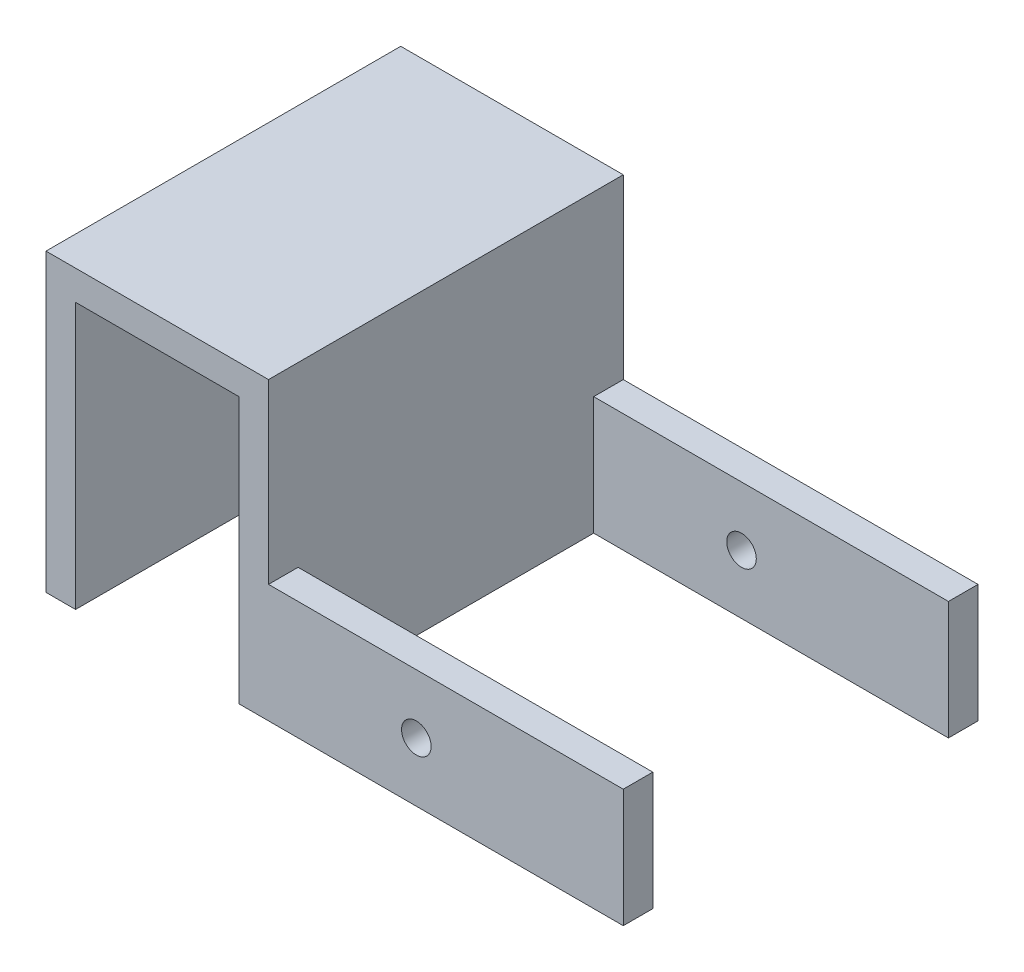
ISO-10303-21;
HEADER;
FILE_DESCRIPTION(('STEP AP214'),'2;1');
FILE_NAME('part.step','',(''),(''),'','','');
FILE_SCHEMA(('AUTOMOTIVE_DESIGN { 1 0 10303 214 1 1 1 1 }'));
ENDSEC;
DATA;
#1=APPLICATION_CONTEXT('core data for automotive mechanical design processes');
#2=APPLICATION_PROTOCOL_DEFINITION('international standard','automotive_design',2000,#1);
#3=PRODUCT_CONTEXT('',#1,'mechanical');
#4=PRODUCT('Part','Part','',(#3));
#5=PRODUCT_RELATED_PRODUCT_CATEGORY('part','',(#4));
#6=PRODUCT_DEFINITION_FORMATION('','',#4);
#7=PRODUCT_DEFINITION_CONTEXT('part definition',#1,'design');
#8=PRODUCT_DEFINITION('design','',#6,#7);
#9=PRODUCT_DEFINITION_SHAPE('','',#8);
#10=(LENGTH_UNIT() NAMED_UNIT(*) SI_UNIT(.MILLI.,.METRE.));
#11=(NAMED_UNIT(*) PLANE_ANGLE_UNIT() SI_UNIT($,.RADIAN.));
#12=(NAMED_UNIT(*) SI_UNIT($,.STERADIAN.) SOLID_ANGLE_UNIT());
#13=UNCERTAINTY_MEASURE_WITH_UNIT(LENGTH_MEASURE(1.E-05),#10,'distance_accuracy_value','');
#14=(GEOMETRIC_REPRESENTATION_CONTEXT(3) GLOBAL_UNCERTAINTY_ASSIGNED_CONTEXT((#13)) GLOBAL_UNIT_ASSIGNED_CONTEXT((#10,
#11,#12)) REPRESENTATION_CONTEXT('',''));
#15=CARTESIAN_POINT('',(0.,0.,0.));
#16=DIRECTION('',(0.,0.,1.));
#17=DIRECTION('',(1.,0.,0.));
#18=AXIS2_PLACEMENT_3D('',#15,#16,#17);
#19=CARTESIAN_POINT('',(5.,0.,30.));
#20=DIRECTION('',(0.,1.,0.));
#21=DIRECTION('',(-1.,0.,0.));
#22=AXIS2_PLACEMENT_3D('',#19,#20,#21);
#23=PLANE('',#22);
#24=DIRECTION('',(1.,0.,0.));
#25=VECTOR('',#24,1.);
#26=CARTESIAN_POINT('',(5.,0.,-30.));
#27=LINE('',#26,#25);
#28=CARTESIAN_POINT('',(0.,0.,-30.));
#29=VERTEX_POINT('',#28);
#30=CARTESIAN_POINT('',(5.,0.,-30.));
#31=VERTEX_POINT('',#30);
#32=EDGE_CURVE('E195',#29,#31,#27,.T.);
#33=ORIENTED_EDGE('',*,*,#32,.T.);
#34=DIRECTION('',(0.,0.,-1.));
#35=VECTOR('',#34,1.);
#36=CARTESIAN_POINT('',(5.,0.,30.));
#37=LINE('',#36,#35);
#38=CARTESIAN_POINT('',(5.,0.,30.));
#39=VERTEX_POINT('',#38);
#40=EDGE_CURVE('E11',#39,#31,#37,.T.);
#41=ORIENTED_EDGE('',*,*,#40,.F.);
#42=DIRECTION('',(1.,0.,0.));
#43=VECTOR('',#42,1.);
#44=CARTESIAN_POINT('',(5.,0.,30.));
#45=LINE('',#44,#43);
#46=CARTESIAN_POINT('',(0.,0.,30.));
#47=VERTEX_POINT('',#46);
#48=EDGE_CURVE('E199',#47,#39,#45,.T.);
#49=ORIENTED_EDGE('',*,*,#48,.F.);
#50=DIRECTION('',(0.,0.,-1.));
#51=VECTOR('',#50,1.);
#52=CARTESIAN_POINT('',(0.,0.,30.));
#53=LINE('',#52,#51);
#54=EDGE_CURVE('E217',#47,#29,#53,.T.);
#55=ORIENTED_EDGE('',*,*,#54,.T.);
#56=EDGE_LOOP('',(#33,#41,#49,#55));
#57=FACE_BOUND('',#56,.T.);
#58=ADVANCED_FACE('F33',(#57),#23,.F.);
#59=CARTESIAN_POINT('',(5.,0.,30.));
#60=DIRECTION('',(-1.,0.,0.));
#61=DIRECTION('',(0.,0.,1.));
#62=AXIS2_PLACEMENT_3D('',#59,#60,#61);
#63=PLANE('',#62);
#64=DIRECTION('',(0.,1.,0.));
#65=VECTOR('',#64,1.);
#66=CARTESIAN_POINT('',(5.,0.,-30.));
#67=LINE('',#66,#65);
#68=CARTESIAN_POINT('',(5.,45.,-30.));
#69=VERTEX_POINT('',#68);
#70=EDGE_CURVE('E220',#31,#69,#67,.T.);
#71=ORIENTED_EDGE('',*,*,#70,.T.);
#72=DIRECTION('',(0.,0.,-1.));
#73=VECTOR('',#72,1.);
#74=CARTESIAN_POINT('',(5.,45.,30.));
#75=LINE('',#74,#73);
#76=CARTESIAN_POINT('',(5.,45.,30.));
#77=VERTEX_POINT('',#76);
#78=EDGE_CURVE('E41',#77,#69,#75,.T.);
#79=ORIENTED_EDGE('',*,*,#78,.F.);
#80=DIRECTION('',(0.,1.,0.));
#81=VECTOR('',#80,1.);
#82=CARTESIAN_POINT('',(5.,0.,30.));
#83=LINE('',#82,#81);
#84=EDGE_CURVE('E202',#39,#77,#83,.T.);
#85=ORIENTED_EDGE('',*,*,#84,.F.);
#86=ORIENTED_EDGE('',*,*,#40,.T.);
#87=EDGE_LOOP('',(#71,#79,#85,#86));
#88=FACE_BOUND('',#87,.T.);
#89=ADVANCED_FACE('F282',(#88),#63,.F.);
#90=CARTESIAN_POINT('',(5.,45.,30.));
#91=DIRECTION('',(0.,1.,0.));
#92=DIRECTION('',(0.,0.,1.));
#93=AXIS2_PLACEMENT_3D('',#90,#91,#92);
#94=PLANE('',#93);
#95=DIRECTION('',(1.,0.,0.));
#96=VECTOR('',#95,1.);
#97=CARTESIAN_POINT('',(5.,45.,-30.));
#98=LINE('',#97,#96);
#99=CARTESIAN_POINT('',(32.64,45.,-30.));
#100=VERTEX_POINT('',#99);
#101=EDGE_CURVE('E222',#69,#100,#98,.T.);
#102=ORIENTED_EDGE('',*,*,#101,.T.);
#103=DIRECTION('',(0.,0.,-1.));
#104=VECTOR('',#103,1.);
#105=CARTESIAN_POINT('',(32.64,45.,30.));
#106=LINE('',#105,#104);
#107=CARTESIAN_POINT('',(32.64,45.,30.));
#108=VERTEX_POINT('',#107);
#109=EDGE_CURVE('E240',#108,#100,#106,.T.);
#110=ORIENTED_EDGE('',*,*,#109,.F.);
#111=DIRECTION('',(1.,0.,0.));
#112=VECTOR('',#111,1.);
#113=CARTESIAN_POINT('',(5.,45.,30.));
#114=LINE('',#113,#112);
#115=EDGE_CURVE('E205',#77,#108,#114,.T.);
#116=ORIENTED_EDGE('',*,*,#115,.F.);
#117=ORIENTED_EDGE('',*,*,#78,.T.);
#118=EDGE_LOOP('',(#102,#110,#116,#117));
#119=FACE_BOUND('',#118,.T.);
#120=ADVANCED_FACE('F248',(#119),#94,.F.);
#121=CARTESIAN_POINT('',(32.64,45.,30.));
#122=DIRECTION('',(1.,0.,0.));
#123=DIRECTION('',(0.,1.,0.));
#124=AXIS2_PLACEMENT_3D('',#121,#122,#123);
#125=PLANE('',#124);
#126=DIRECTION('',(0.,-1.,0.));
#127=VECTOR('',#126,1.);
#128=CARTESIAN_POINT('',(32.64,45.,-30.));
#129=LINE('',#128,#127);
#130=CARTESIAN_POINT('',(32.64,0.,-30.));
#131=VERTEX_POINT('',#130);
#132=EDGE_CURVE('E224',#100,#131,#129,.T.);
#133=ORIENTED_EDGE('',*,*,#132,.T.);
#134=DIRECTION('',(0.,0.,-1.));
#135=VECTOR('',#134,1.);
#136=CARTESIAN_POINT('',(32.64,0.,30.));
#137=LINE('',#136,#135);
#138=CARTESIAN_POINT('',(32.64,0.,30.));
#139=VERTEX_POINT('',#138);
#140=EDGE_CURVE('E237',#139,#131,#137,.T.);
#141=ORIENTED_EDGE('',*,*,#140,.F.);
#142=DIRECTION('',(0.,-1.,0.));
#143=VECTOR('',#142,1.);
#144=CARTESIAN_POINT('',(32.64,45.,30.));
#145=LINE('',#144,#143);
#146=EDGE_CURVE('E207',#108,#139,#145,.T.);
#147=ORIENTED_EDGE('',*,*,#146,.F.);
#148=ORIENTED_EDGE('',*,*,#109,.T.);
#149=EDGE_LOOP('',(#133,#141,#147,#148));
#150=FACE_BOUND('',#149,.T.);
#151=ADVANCED_FACE('F255',(#150),#125,.F.);
#152=CARTESIAN_POINT('',(37.64,0.,30.));
#153=DIRECTION('',(0.,1.,0.));
#154=DIRECTION('',(-1.,0.,0.));
#155=AXIS2_PLACEMENT_3D('',#152,#153,#154);
#156=PLANE('',#155);
#157=DIRECTION('',(1.,0.,0.));
#158=VECTOR('',#157,1.);
#159=CARTESIAN_POINT('',(37.64,0.,-30.));
#160=LINE('',#159,#158);
#161=CARTESIAN_POINT('',(97.64,-1.35493385389689E-13,-30.));
#162=VERTEX_POINT('',#161);
#163=EDGE_CURVE('E145',#131,#162,#160,.T.);
#164=ORIENTED_EDGE('',*,*,#163,.T.);
#165=DIRECTION('',(0.,0.,1.));
#166=VECTOR('',#165,1.);
#167=CARTESIAN_POINT('',(97.64,-1.35493385389689E-13,-30.));
#168=LINE('',#167,#166);
#169=CARTESIAN_POINT('',(97.64,-1.35493385389689E-13,-25.));
#170=VERTEX_POINT('',#169);
#171=EDGE_CURVE('E164',#162,#170,#168,.T.);
#172=ORIENTED_EDGE('',*,*,#171,.T.);
#173=DIRECTION('',(-1.,0.,0.));
#174=VECTOR('',#173,1.);
#175=CARTESIAN_POINT('',(97.64,-1.35493385389689E-13,-25.));
#176=LINE('',#175,#174);
#177=CARTESIAN_POINT('',(37.64,0.,-25.));
#178=VERTEX_POINT('',#177);
#179=EDGE_CURVE('E161',#170,#178,#176,.T.);
#180=ORIENTED_EDGE('',*,*,#179,.T.);
#181=DIRECTION('',(0.,0.,-1.));
#182=VECTOR('',#181,1.);
#183=CARTESIAN_POINT('',(37.64,0.,30.));
#184=LINE('',#183,#182);
#185=CARTESIAN_POINT('',(37.64,0.,25.));
#186=VERTEX_POINT('',#185);
#187=EDGE_CURVE('E53',#186,#178,#184,.T.);
#188=ORIENTED_EDGE('',*,*,#187,.F.);
#189=DIRECTION('',(1.,0.,0.));
#190=VECTOR('',#189,1.);
#191=CARTESIAN_POINT('',(97.64,-1.35493385389689E-13,25.));
#192=LINE('',#191,#190);
#193=CARTESIAN_POINT('',(97.64,-1.35493385389689E-13,25.));
#194=VERTEX_POINT('',#193);
#195=EDGE_CURVE('E170',#186,#194,#192,.T.);
#196=ORIENTED_EDGE('',*,*,#195,.T.);
#197=DIRECTION('',(0.,0.,1.));
#198=VECTOR('',#197,1.);
#199=CARTESIAN_POINT('',(97.64,-1.35493385389689E-13,30.));
#200=LINE('',#199,#198);
#201=CARTESIAN_POINT('',(97.64,-1.35493385389689E-13,30.));
#202=VERTEX_POINT('',#201);
#203=EDGE_CURVE('E178',#194,#202,#200,.T.);
#204=ORIENTED_EDGE('',*,*,#203,.T.);
#205=DIRECTION('',(1.,0.,0.));
#206=VECTOR('',#205,1.);
#207=CARTESIAN_POINT('',(37.64,0.,30.));
#208=LINE('',#207,#206);
#209=EDGE_CURVE('E209',#139,#202,#208,.T.);
#210=ORIENTED_EDGE('',*,*,#209,.F.);
#211=ORIENTED_EDGE('',*,*,#140,.T.);
#212=EDGE_LOOP('',(#164,#172,#180,#188,#196,#204,#210,#211));
#213=FACE_BOUND('',#212,.T.);
#214=ADVANCED_FACE('F259',(#213),#156,.F.);
#215=CARTESIAN_POINT('',(37.64,50.,30.));
#216=DIRECTION('',(-1.,0.,0.));
#217=DIRECTION('',(0.,-1.,0.));
#218=AXIS2_PLACEMENT_3D('',#215,#216,#217);
#219=PLANE('',#218);
#220=ORIENTED_EDGE('',*,*,#187,.T.);
#221=DIRECTION('',(0.,-1.,0.));
#222=VECTOR('',#221,1.);
#223=CARTESIAN_POINT('',(37.64,19.9999999999999,-25.));
#224=LINE('',#223,#222);
#225=CARTESIAN_POINT('',(37.64,19.9999999999999,-25.));
#226=VERTEX_POINT('',#225);
#227=EDGE_CURVE('E48',#226,#178,#224,.T.);
#228=ORIENTED_EDGE('',*,*,#227,.F.);
#229=DIRECTION('',(0.,0.,-1.));
#230=VECTOR('',#229,1.);
#231=CARTESIAN_POINT('',(37.64,19.9999999999999,-25.));
#232=LINE('',#231,#230);
#233=CARTESIAN_POINT('',(37.64,19.9999999999999,-30.));
#234=VERTEX_POINT('',#233);
#235=EDGE_CURVE('E147',#226,#234,#232,.T.);
#236=ORIENTED_EDGE('',*,*,#235,.T.);
#237=DIRECTION('',(0.,1.,0.));
#238=VECTOR('',#237,1.);
#239=CARTESIAN_POINT('',(37.64,50.,-30.));
#240=LINE('',#239,#238);
#241=CARTESIAN_POINT('',(37.64,50.,-30.));
#242=VERTEX_POINT('',#241);
#243=EDGE_CURVE('E134',#234,#242,#240,.T.);
#244=ORIENTED_EDGE('',*,*,#243,.T.);
#245=DIRECTION('',(0.,0.,-1.));
#246=VECTOR('',#245,1.);
#247=CARTESIAN_POINT('',(37.64,50.,30.));
#248=LINE('',#247,#246);
#249=CARTESIAN_POINT('',(37.64,50.,30.));
#250=VERTEX_POINT('',#249);
#251=EDGE_CURVE('E234',#250,#242,#248,.T.);
#252=ORIENTED_EDGE('',*,*,#251,.F.);
#253=DIRECTION('',(0.,1.,0.));
#254=VECTOR('',#253,1.);
#255=CARTESIAN_POINT('',(37.64,50.,30.));
#256=LINE('',#255,#254);
#257=CARTESIAN_POINT('',(37.64,19.9999999999999,30.));
#258=VERTEX_POINT('',#257);
#259=EDGE_CURVE('E211',#258,#250,#256,.T.);
#260=ORIENTED_EDGE('',*,*,#259,.F.);
#261=DIRECTION('',(0.,0.,-1.));
#262=VECTOR('',#261,1.);
#263=CARTESIAN_POINT('',(37.64,19.9999999999999,25.));
#264=LINE('',#263,#262);
#265=CARTESIAN_POINT('',(37.64,19.9999999999999,25.));
#266=VERTEX_POINT('',#265);
#267=EDGE_CURVE('E174',#258,#266,#264,.T.);
#268=ORIENTED_EDGE('',*,*,#267,.T.);
#269=DIRECTION('',(0.,-1.,0.));
#270=VECTOR('',#269,1.);
#271=CARTESIAN_POINT('',(37.64,19.9999999999999,25.));
#272=LINE('',#271,#270);
#273=EDGE_CURVE('E187',#266,#186,#272,.T.);
#274=ORIENTED_EDGE('',*,*,#273,.T.);
#275=EDGE_LOOP('',(#220,#228,#236,#244,#252,#260,#268,#274));
#276=FACE_BOUND('',#275,.T.);
#277=ADVANCED_FACE('F148',(#276),#219,.F.);
#278=CARTESIAN_POINT('',(0.,50.,30.));
#279=DIRECTION('',(0.,-1.,0.));
#280=DIRECTION('',(1.,0.,0.));
#281=AXIS2_PLACEMENT_3D('',#278,#279,#280);
#282=PLANE('',#281);
#283=DIRECTION('',(-1.,0.,0.));
#284=VECTOR('',#283,1.);
#285=CARTESIAN_POINT('',(0.,50.,-30.));
#286=LINE('',#285,#284);
#287=CARTESIAN_POINT('',(0.,50.,-30.));
#288=VERTEX_POINT('',#287);
#289=EDGE_CURVE('E142',#242,#288,#286,.T.);
#290=ORIENTED_EDGE('',*,*,#289,.T.);
#291=DIRECTION('',(0.,0.,-1.));
#292=VECTOR('',#291,1.);
#293=CARTESIAN_POINT('',(0.,50.,30.));
#294=LINE('',#293,#292);
#295=CARTESIAN_POINT('',(0.,50.,30.));
#296=VERTEX_POINT('',#295);
#297=EDGE_CURVE('E231',#296,#288,#294,.T.);
#298=ORIENTED_EDGE('',*,*,#297,.F.);
#299=DIRECTION('',(-1.,0.,0.));
#300=VECTOR('',#299,1.);
#301=CARTESIAN_POINT('',(0.,50.,30.));
#302=LINE('',#301,#300);
#303=EDGE_CURVE('E213',#250,#296,#302,.T.);
#304=ORIENTED_EDGE('',*,*,#303,.F.);
#305=ORIENTED_EDGE('',*,*,#251,.T.);
#306=EDGE_LOOP('',(#290,#298,#304,#305));
#307=FACE_BOUND('',#306,.T.);
#308=ADVANCED_FACE('F274',(#307),#282,.F.);
#309=CARTESIAN_POINT('',(0.,0.,30.));
#310=DIRECTION('',(1.,0.,0.));
#311=DIRECTION('',(0.,1.,0.));
#312=AXIS2_PLACEMENT_3D('',#309,#310,#311);
#313=PLANE('',#312);
#314=DIRECTION('',(0.,-1.,0.));
#315=VECTOR('',#314,1.);
#316=CARTESIAN_POINT('',(0.,0.,-30.));
#317=LINE('',#316,#315);
#318=EDGE_CURVE('E203',#288,#29,#317,.T.);
#319=ORIENTED_EDGE('',*,*,#318,.T.);
#320=ORIENTED_EDGE('',*,*,#54,.F.);
#321=DIRECTION('',(0.,-1.,0.));
#322=VECTOR('',#321,1.);
#323=CARTESIAN_POINT('',(0.,0.,30.));
#324=LINE('',#323,#322);
#325=EDGE_CURVE('E215',#296,#47,#324,.T.);
#326=ORIENTED_EDGE('',*,*,#325,.F.);
#327=ORIENTED_EDGE('',*,*,#297,.T.);
#328=EDGE_LOOP('',(#319,#320,#326,#327));
#329=FACE_BOUND('',#328,.T.);
#330=ADVANCED_FACE('F280',(#329),#313,.F.);
#331=CARTESIAN_POINT('',(0.,0.,30.));
#332=DIRECTION('',(0.,0.,-1.));
#333=DIRECTION('',(-1.,0.,0.));
#334=AXIS2_PLACEMENT_3D('',#331,#332,#333);
#335=PLANE('',#334);
#336=CARTESIAN_POINT('',(62.64,9.99999999999986,30.));
#337=DIRECTION('',(0.,0.,1.));
#338=DIRECTION('',(1.,0.,0.));
#339=AXIS2_PLACEMENT_3D('',#336,#337,#338);
#340=CIRCLE('',#339,2.49999999999999);
#341=CARTESIAN_POINT('',(65.14,9.99999999999986,30.));
#342=VERTEX_POINT('',#341);
#343=EDGE_CURVE('E338',#342,#342,#340,.T.);
#344=ORIENTED_EDGE('',*,*,#343,.F.);
#345=EDGE_LOOP('',(#344));
#346=FACE_BOUND('',#345,.T.);
#347=ORIENTED_EDGE('',*,*,#48,.T.);
#348=ORIENTED_EDGE('',*,*,#84,.T.);
#349=ORIENTED_EDGE('',*,*,#115,.T.);
#350=ORIENTED_EDGE('',*,*,#146,.T.);
#351=ORIENTED_EDGE('',*,*,#209,.T.);
#352=DIRECTION('',(0.,-1.,0.));
#353=VECTOR('',#352,1.);
#354=CARTESIAN_POINT('',(97.64,19.9999999999999,30.));
#355=LINE('',#354,#353);
#356=CARTESIAN_POINT('',(97.64,19.9999999999999,30.));
#357=VERTEX_POINT('',#356);
#358=EDGE_CURVE('E192',#357,#202,#355,.T.);
#359=ORIENTED_EDGE('',*,*,#358,.F.);
#360=DIRECTION('',(-1.,0.,0.));
#361=VECTOR('',#360,1.);
#362=CARTESIAN_POINT('',(37.64,19.9999999999999,30.));
#363=LINE('',#362,#361);
#364=EDGE_CURVE('E184',#357,#258,#363,.T.);
#365=ORIENTED_EDGE('',*,*,#364,.T.);
#366=ORIENTED_EDGE('',*,*,#259,.T.);
#367=ORIENTED_EDGE('',*,*,#303,.T.);
#368=ORIENTED_EDGE('',*,*,#325,.T.);
#369=EDGE_LOOP('',(#347,#348,#349,#350,#351,#359,#365,#366,#367,#368));
#370=FACE_BOUND('',#369,.T.);
#371=ADVANCED_FACE('F262',(#346,#370),#335,.F.);
#372=CARTESIAN_POINT('',(0.,0.,-30.));
#373=DIRECTION('',(0.,0.,-1.));
#374=DIRECTION('',(-1.,0.,0.));
#375=AXIS2_PLACEMENT_3D('',#372,#373,#374);
#376=PLANE('',#375);
#377=CARTESIAN_POINT('',(62.64,9.99999999999986,-30.));
#378=DIRECTION('',(0.,0.,1.));
#379=DIRECTION('',(1.,0.,0.));
#380=AXIS2_PLACEMENT_3D('',#377,#378,#379);
#381=CIRCLE('',#380,2.49999999999999);
#382=CARTESIAN_POINT('',(65.14,9.99999999999986,-30.));
#383=VERTEX_POINT('',#382);
#384=EDGE_CURVE('E337',#383,#383,#381,.T.);
#385=ORIENTED_EDGE('',*,*,#384,.T.);
#386=EDGE_LOOP('',(#385));
#387=FACE_BOUND('',#386,.T.);
#388=ORIENTED_EDGE('',*,*,#32,.F.);
#389=ORIENTED_EDGE('',*,*,#318,.F.);
#390=ORIENTED_EDGE('',*,*,#289,.F.);
#391=ORIENTED_EDGE('',*,*,#243,.F.);
#392=DIRECTION('',(1.,0.,0.));
#393=VECTOR('',#392,1.);
#394=CARTESIAN_POINT('',(37.64,19.9999999999999,-30.));
#395=LINE('',#394,#393);
#396=CARTESIAN_POINT('',(97.64,19.9999999999999,-30.));
#397=VERTEX_POINT('',#396);
#398=EDGE_CURVE('E139',#234,#397,#395,.T.);
#399=ORIENTED_EDGE('',*,*,#398,.T.);
#400=DIRECTION('',(0.,-1.,0.));
#401=VECTOR('',#400,1.);
#402=CARTESIAN_POINT('',(97.64,19.9999999999999,-30.));
#403=LINE('',#402,#401);
#404=EDGE_CURVE('E171',#397,#162,#403,.T.);
#405=ORIENTED_EDGE('',*,*,#404,.T.);
#406=ORIENTED_EDGE('',*,*,#163,.F.);
#407=ORIENTED_EDGE('',*,*,#132,.F.);
#408=ORIENTED_EDGE('',*,*,#101,.F.);
#409=ORIENTED_EDGE('',*,*,#70,.F.);
#410=EDGE_LOOP('',(#388,#389,#390,#391,#399,#405,#406,#407,#408,#409));
#411=FACE_BOUND('',#410,.T.);
#412=ADVANCED_FACE('F136',(#387,#411),#376,.T.);
#413=CARTESIAN_POINT('',(97.64,19.9999999999999,30.));
#414=DIRECTION('',(1.,0.,0.));
#415=DIRECTION('',(0.,1.,0.));
#416=AXIS2_PLACEMENT_3D('',#413,#414,#415);
#417=PLANE('',#416);
#418=ORIENTED_EDGE('',*,*,#203,.F.);
#419=DIRECTION('',(0.,-1.,0.));
#420=VECTOR('',#419,1.);
#421=CARTESIAN_POINT('',(97.64,19.9999999999999,25.));
#422=LINE('',#421,#420);
#423=CARTESIAN_POINT('',(97.64,19.9999999999999,25.));
#424=VERTEX_POINT('',#423);
#425=EDGE_CURVE('E196',#424,#194,#422,.T.);
#426=ORIENTED_EDGE('',*,*,#425,.F.);
#427=DIRECTION('',(0.,0.,1.));
#428=VECTOR('',#427,1.);
#429=CARTESIAN_POINT('',(97.64,19.9999999999999,30.));
#430=LINE('',#429,#428);
#431=EDGE_CURVE('E181',#424,#357,#430,.T.);
#432=ORIENTED_EDGE('',*,*,#431,.T.);
#433=ORIENTED_EDGE('',*,*,#358,.T.);
#434=EDGE_LOOP('',(#418,#426,#432,#433));
#435=FACE_BOUND('',#434,.T.);
#436=ADVANCED_FACE('F264',(#435),#417,.T.);
#437=CARTESIAN_POINT('',(97.64,19.9999999999999,25.));
#438=DIRECTION('',(0.,0.,-1.));
#439=DIRECTION('',(-1.,0.,0.));
#440=AXIS2_PLACEMENT_3D('',#437,#438,#439);
#441=PLANE('',#440);
#442=CARTESIAN_POINT('',(62.64,9.99999999999986,25.));
#443=DIRECTION('',(0.,0.,-1.));
#444=DIRECTION('',(-1.,0.,0.));
#445=AXIS2_PLACEMENT_3D('',#442,#443,#444);
#446=CIRCLE('',#445,2.49999999999999);
#447=CARTESIAN_POINT('',(60.14,9.99999999999986,25.));
#448=VERTEX_POINT('',#447);
#449=EDGE_CURVE('E165',#448,#448,#446,.T.);
#450=ORIENTED_EDGE('',*,*,#449,.F.);
#451=EDGE_LOOP('',(#450));
#452=FACE_BOUND('',#451,.T.);
#453=ORIENTED_EDGE('',*,*,#195,.F.);
#454=ORIENTED_EDGE('',*,*,#273,.F.);
#455=DIRECTION('',(1.,0.,0.));
#456=VECTOR('',#455,1.);
#457=CARTESIAN_POINT('',(97.64,19.9999999999999,25.));
#458=LINE('',#457,#456);
#459=EDGE_CURVE('E177',#266,#424,#458,.T.);
#460=ORIENTED_EDGE('',*,*,#459,.T.);
#461=ORIENTED_EDGE('',*,*,#425,.T.);
#462=EDGE_LOOP('',(#453,#454,#460,#461));
#463=FACE_BOUND('',#462,.T.);
#464=ADVANCED_FACE('F306',(#452,#463),#441,.T.);
#465=CARTESIAN_POINT('',(0.,20.,0.));
#466=DIRECTION('',(0.,1.,0.));
#467=DIRECTION('',(-1.,0.,0.));
#468=AXIS2_PLACEMENT_3D('',#465,#466,#467);
#469=PLANE('',#468);
#470=ORIENTED_EDGE('',*,*,#267,.F.);
#471=ORIENTED_EDGE('',*,*,#364,.F.);
#472=ORIENTED_EDGE('',*,*,#431,.F.);
#473=ORIENTED_EDGE('',*,*,#459,.F.);
#474=EDGE_LOOP('',(#470,#471,#472,#473));
#475=FACE_BOUND('',#474,.T.);
#476=ADVANCED_FACE('F269',(#475),#469,.T.);
#477=CARTESIAN_POINT('',(97.64,19.9999999999999,-25.));
#478=DIRECTION('',(0.,0.,1.));
#479=DIRECTION('',(1.,0.,0.));
#480=AXIS2_PLACEMENT_3D('',#477,#478,#479);
#481=PLANE('',#480);
#482=CARTESIAN_POINT('',(62.64,9.99999999999986,-25.));
#483=DIRECTION('',(0.,0.,1.));
#484=DIRECTION('',(1.,0.,0.));
#485=AXIS2_PLACEMENT_3D('',#482,#483,#484);
#486=CIRCLE('',#485,2.49999999999999);
#487=CARTESIAN_POINT('',(65.14,9.99999999999986,-25.));
#488=VERTEX_POINT('',#487);
#489=EDGE_CURVE('E36',#488,#488,#486,.T.);
#490=ORIENTED_EDGE('',*,*,#489,.F.);
#491=EDGE_LOOP('',(#490));
#492=FACE_BOUND('',#491,.T.);
#493=ORIENTED_EDGE('',*,*,#179,.F.);
#494=DIRECTION('',(0.,-1.,0.));
#495=VECTOR('',#494,1.);
#496=CARTESIAN_POINT('',(97.64,19.9999999999999,-25.));
#497=LINE('',#496,#495);
#498=CARTESIAN_POINT('',(97.64,19.9999999999999,-25.));
#499=VERTEX_POINT('',#498);
#500=EDGE_CURVE('E168',#499,#170,#497,.T.);
#501=ORIENTED_EDGE('',*,*,#500,.F.);
#502=DIRECTION('',(-1.,0.,0.));
#503=VECTOR('',#502,1.);
#504=CARTESIAN_POINT('',(97.64,19.9999999999999,-25.));
#505=LINE('',#504,#503);
#506=EDGE_CURVE('E152',#499,#226,#505,.T.);
#507=ORIENTED_EDGE('',*,*,#506,.T.);
#508=ORIENTED_EDGE('',*,*,#227,.T.);
#509=EDGE_LOOP('',(#493,#501,#507,#508));
#510=FACE_BOUND('',#509,.T.);
#511=ADVANCED_FACE('F314',(#492,#510),#481,.T.);
#512=CARTESIAN_POINT('',(97.64,19.9999999999999,-30.));
#513=DIRECTION('',(1.,0.,0.));
#514=DIRECTION('',(0.,1.,0.));
#515=AXIS2_PLACEMENT_3D('',#512,#513,#514);
#516=PLANE('',#515);
#517=ORIENTED_EDGE('',*,*,#171,.F.);
#518=ORIENTED_EDGE('',*,*,#404,.F.);
#519=DIRECTION('',(0.,0.,1.));
#520=VECTOR('',#519,1.);
#521=CARTESIAN_POINT('',(97.64,19.9999999999999,-30.));
#522=LINE('',#521,#520);
#523=EDGE_CURVE('E156',#397,#499,#522,.T.);
#524=ORIENTED_EDGE('',*,*,#523,.T.);
#525=ORIENTED_EDGE('',*,*,#500,.T.);
#526=EDGE_LOOP('',(#517,#518,#524,#525));
#527=FACE_BOUND('',#526,.T.);
#528=ADVANCED_FACE('F317',(#527),#516,.T.);
#529=CARTESIAN_POINT('',(0.,20.,0.));
#530=DIRECTION('',(0.,-1.,0.));
#531=DIRECTION('',(1.,0.,0.));
#532=AXIS2_PLACEMENT_3D('',#529,#530,#531);
#533=PLANE('',#532);
#534=ORIENTED_EDGE('',*,*,#506,.F.);
#535=ORIENTED_EDGE('',*,*,#523,.F.);
#536=ORIENTED_EDGE('',*,*,#398,.F.);
#537=ORIENTED_EDGE('',*,*,#235,.F.);
#538=EDGE_LOOP('',(#534,#535,#536,#537));
#539=FACE_BOUND('',#538,.T.);
#540=ADVANCED_FACE('F154',(#539),#533,.F.);
#541=CARTESIAN_POINT('',(62.64,9.99999999999986,-30.));
#542=DIRECTION('',(0.,0.,1.));
#543=DIRECTION('',(1.,0.,0.));
#544=AXIS2_PLACEMENT_3D('',#541,#542,#543);
#545=CYLINDRICAL_SURFACE('',#544,2.49999999999999);
#546=ORIENTED_EDGE('',*,*,#489,.T.);
#547=EDGE_LOOP('',(#546));
#548=FACE_BOUND('',#547,.T.);
#549=ORIENTED_EDGE('',*,*,#384,.F.);
#550=EDGE_LOOP('',(#549));
#551=FACE_BOUND('',#550,.T.);
#552=ADVANCED_FACE('F324',(#548,#551),#545,.F.);
#553=ORIENTED_EDGE('',*,*,#449,.T.);
#554=EDGE_LOOP('',(#553));
#555=FACE_BOUND('',#554,.T.);
#556=ORIENTED_EDGE('',*,*,#343,.T.);
#557=EDGE_LOOP('',(#556));
#558=FACE_BOUND('',#557,.T.);
#559=ADVANCED_FACE('F326',(#555,#558),#545,.F.);
#560=CLOSED_SHELL('',(#58,#89,#120,#151,#214,#277,#308,#330,#371,#412,#436,#464,#476,#511,#528,
#540,#552,#559));
#561=MANIFOLD_SOLID_BREP('B2',#560);
#562=ADVANCED_BREP_SHAPE_REPRESENTATION('',(#18,#561),#14);
#563=SHAPE_DEFINITION_REPRESENTATION(#9,#562);
ENDSEC;
END-ISO-10303-21;
